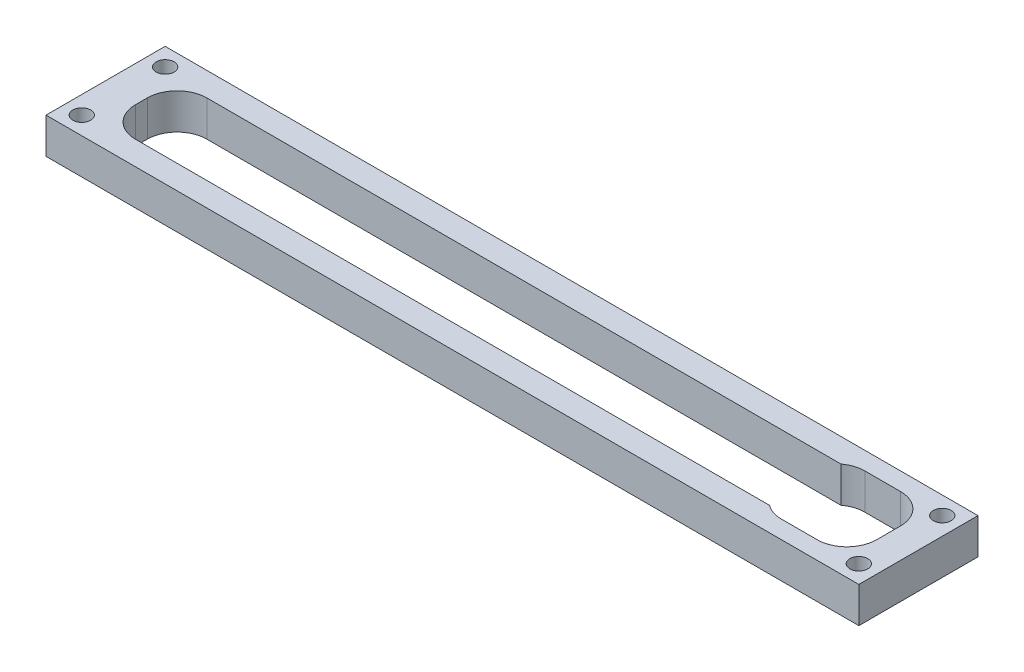
ISO-10303-21;
HEADER;
FILE_DESCRIPTION(('STEP AP214'),'2;1');
FILE_NAME('part.step','',(''),(''),'','','');
FILE_SCHEMA(('AUTOMOTIVE_DESIGN { 1 0 10303 214 1 1 1 1 }'));
ENDSEC;
DATA;
#1=APPLICATION_CONTEXT('core data for automotive mechanical design processes');
#2=APPLICATION_PROTOCOL_DEFINITION('international standard','automotive_design',2000,#1);
#3=PRODUCT_CONTEXT('',#1,'mechanical');
#4=PRODUCT('Part','Part','',(#3));
#5=PRODUCT_RELATED_PRODUCT_CATEGORY('part','',(#4));
#6=PRODUCT_DEFINITION_FORMATION('','',#4);
#7=PRODUCT_DEFINITION_CONTEXT('part definition',#1,'design');
#8=PRODUCT_DEFINITION('design','',#6,#7);
#9=PRODUCT_DEFINITION_SHAPE('','',#8);
#10=(LENGTH_UNIT() NAMED_UNIT(*) SI_UNIT(.MILLI.,.METRE.));
#11=(NAMED_UNIT(*) PLANE_ANGLE_UNIT() SI_UNIT($,.RADIAN.));
#12=(NAMED_UNIT(*) SI_UNIT($,.STERADIAN.) SOLID_ANGLE_UNIT());
#13=UNCERTAINTY_MEASURE_WITH_UNIT(LENGTH_MEASURE(1.E-05),#10,'distance_accuracy_value','');
#14=(GEOMETRIC_REPRESENTATION_CONTEXT(3) GLOBAL_UNCERTAINTY_ASSIGNED_CONTEXT((#13)) GLOBAL_UNIT_ASSIGNED_CONTEXT((#10,
#11,#12)) REPRESENTATION_CONTEXT('',''));
#15=CARTESIAN_POINT('',(0.,0.,0.));
#16=DIRECTION('',(0.,0.,1.));
#17=DIRECTION('',(1.,0.,0.));
#18=AXIS2_PLACEMENT_3D('',#15,#16,#17);
#19=CARTESIAN_POINT('',(0.,6.,0.));
#20=DIRECTION('',(0.,-1.,0.));
#21=DIRECTION('',(0.,0.,-1.));
#22=AXIS2_PLACEMENT_3D('',#19,#20,#21);
#23=PLANE('',#22);
#24=DIRECTION('',(0.,0.,1.));
#25=VECTOR('',#24,1.);
#26=CARTESIAN_POINT('',(0.,6.,0.));
#27=LINE('',#26,#25);
#28=CARTESIAN_POINT('',(0.,6.,-20.));
#29=VERTEX_POINT('',#28);
#30=CARTESIAN_POINT('',(0.,6.,0.));
#31=VERTEX_POINT('',#30);
#32=EDGE_CURVE('E250',#29,#31,#27,.T.);
#33=ORIENTED_EDGE('',*,*,#32,.T.);
#34=DIRECTION('',(1.,0.,0.));
#35=VECTOR('',#34,1.);
#36=CARTESIAN_POINT('',(0.,6.,0.));
#37=LINE('',#36,#35);
#38=CARTESIAN_POINT('',(136.427821804855,6.,0.));
#39=VERTEX_POINT('',#38);
#40=EDGE_CURVE('E253',#31,#39,#37,.T.);
#41=ORIENTED_EDGE('',*,*,#40,.T.);
#42=DIRECTION('',(0.,0.,-1.));
#43=VECTOR('',#42,1.);
#44=CARTESIAN_POINT('',(136.427821804855,6.,0.));
#45=LINE('',#44,#43);
#46=CARTESIAN_POINT('',(136.427821804855,6.,-20.));
#47=VERTEX_POINT('',#46);
#48=EDGE_CURVE('E256',#39,#47,#45,.T.);
#49=ORIENTED_EDGE('',*,*,#48,.T.);
#50=DIRECTION('',(-1.,0.,0.));
#51=VECTOR('',#50,1.);
#52=CARTESIAN_POINT('',(0.,6.,-20.));
#53=LINE('',#52,#51);
#54=EDGE_CURVE('E258',#47,#29,#53,.T.);
#55=ORIENTED_EDGE('',*,*,#54,.T.);
#56=EDGE_LOOP('',(#33,#41,#49,#55));
#57=FACE_BOUND('',#56,.T.);
#58=DIRECTION('',(-1.,0.,0.));
#59=VECTOR('',#58,1.);
#60=CARTESIAN_POINT('',(5.99999999999999,6.,-16.));
#61=LINE('',#60,#59);
#62=CARTESIAN_POINT('',(117.427821804855,6.,-16.));
#63=VERTEX_POINT('',#62);
#64=CARTESIAN_POINT('',(11.,6.,-16.));
#65=VERTEX_POINT('',#64);
#66=EDGE_CURVE('E243',#63,#65,#61,.T.);
#67=ORIENTED_EDGE('',*,*,#66,.F.);
#68=CARTESIAN_POINT('',(120.427821804855,6.,-12.));
#69=DIRECTION('',(0.,-1.,0.));
#70=DIRECTION('',(0.,0.,-1.));
#71=AXIS2_PLACEMENT_3D('',#68,#69,#70);
#72=CIRCLE('',#71,5.);
#73=CARTESIAN_POINT('',(120.427821804855,6.,-17.));
#74=VERTEX_POINT('',#73);
#75=EDGE_CURVE('E193',#63,#74,#72,.T.);
#76=ORIENTED_EDGE('',*,*,#75,.T.);
#77=DIRECTION('',(-1.,0.,0.));
#78=VECTOR('',#77,1.);
#79=CARTESIAN_POINT('',(117.427821804855,6.,-17.));
#80=LINE('',#79,#78);
#81=CARTESIAN_POINT('',(126.427821804855,6.,-17.));
#82=VERTEX_POINT('',#81);
#83=EDGE_CURVE('E205',#82,#74,#80,.T.);
#84=ORIENTED_EDGE('',*,*,#83,.F.);
#85=CARTESIAN_POINT('',(126.427821804855,6.,-12.));
#86=DIRECTION('',(0.,-1.,0.));
#87=DIRECTION('',(0.,0.,-1.));
#88=AXIS2_PLACEMENT_3D('',#85,#86,#87);
#89=CIRCLE('',#88,5.);
#90=CARTESIAN_POINT('',(131.427821804855,6.,-12.));
#91=VERTEX_POINT('',#90);
#92=EDGE_CURVE('E185',#82,#91,#89,.T.);
#93=ORIENTED_EDGE('',*,*,#92,.T.);
#94=DIRECTION('',(0.,0.,-1.));
#95=VECTOR('',#94,1.);
#96=CARTESIAN_POINT('',(131.427821804855,6.,-17.));
#97=LINE('',#96,#95);
#98=CARTESIAN_POINT('',(131.427821804855,6.,-8.00000000000001));
#99=VERTEX_POINT('',#98);
#100=EDGE_CURVE('E202',#99,#91,#97,.T.);
#101=ORIENTED_EDGE('',*,*,#100,.F.);
#102=CARTESIAN_POINT('',(126.427821804855,6.,-8.00000000000001));
#103=DIRECTION('',(0.,-1.,0.));
#104=DIRECTION('',(0.,0.,-1.));
#105=AXIS2_PLACEMENT_3D('',#102,#103,#104);
#106=CIRCLE('',#105,5.);
#107=CARTESIAN_POINT('',(126.427821804855,6.,-3.00000000000001));
#108=VERTEX_POINT('',#107);
#109=EDGE_CURVE('E189',#99,#108,#106,.T.);
#110=ORIENTED_EDGE('',*,*,#109,.T.);
#111=DIRECTION('',(1.,0.,0.));
#112=VECTOR('',#111,1.);
#113=CARTESIAN_POINT('',(117.427821804855,6.,-3.00000000000001));
#114=LINE('',#113,#112);
#115=CARTESIAN_POINT('',(120.427821804855,6.,-3.00000000000001));
#116=VERTEX_POINT('',#115);
#117=EDGE_CURVE('E200',#116,#108,#114,.T.);
#118=ORIENTED_EDGE('',*,*,#117,.F.);
#119=CARTESIAN_POINT('',(120.427821804855,6.,-8.00000000000001));
#120=DIRECTION('',(0.,-1.,0.));
#121=DIRECTION('',(0.,0.,-1.));
#122=AXIS2_PLACEMENT_3D('',#119,#120,#121);
#123=CIRCLE('',#122,5.);
#124=CARTESIAN_POINT('',(117.427821804855,6.,-4.00000000000002));
#125=VERTEX_POINT('',#124);
#126=EDGE_CURVE('E43',#116,#125,#123,.T.);
#127=ORIENTED_EDGE('',*,*,#126,.T.);
#128=DIRECTION('',(1.,0.,0.));
#129=VECTOR('',#128,1.);
#130=CARTESIAN_POINT('',(5.99999999999999,6.,-4.00000000000002));
#131=LINE('',#130,#129);
#132=CARTESIAN_POINT('',(11.,6.,-4.00000000000002));
#133=VERTEX_POINT('',#132);
#134=EDGE_CURVE('E162',#133,#125,#131,.T.);
#135=ORIENTED_EDGE('',*,*,#134,.F.);
#136=CARTESIAN_POINT('',(11.,6.,-9.00000000000001));
#137=DIRECTION('',(0.,-1.,0.));
#138=DIRECTION('',(0.,0.,-1.));
#139=AXIS2_PLACEMENT_3D('',#136,#137,#138);
#140=CIRCLE('',#139,5.);
#141=CARTESIAN_POINT('',(5.99999999999999,6.,-9.00000000000001));
#142=VERTEX_POINT('',#141);
#143=EDGE_CURVE('E179',#133,#142,#140,.T.);
#144=ORIENTED_EDGE('',*,*,#143,.T.);
#145=DIRECTION('',(0.,0.,1.));
#146=VECTOR('',#145,1.);
#147=CARTESIAN_POINT('',(5.99999999999999,6.,-16.));
#148=LINE('',#147,#146);
#149=CARTESIAN_POINT('',(5.99999999999999,6.,-11.));
#150=VERTEX_POINT('',#149);
#151=EDGE_CURVE('E239',#150,#142,#148,.T.);
#152=ORIENTED_EDGE('',*,*,#151,.F.);
#153=CARTESIAN_POINT('',(11.,6.,-11.));
#154=DIRECTION('',(0.,-1.,0.));
#155=DIRECTION('',(0.,0.,-1.));
#156=AXIS2_PLACEMENT_3D('',#153,#154,#155);
#157=CIRCLE('',#156,5.);
#158=EDGE_CURVE('E183',#150,#65,#157,.T.);
#159=ORIENTED_EDGE('',*,*,#158,.T.);
#160=EDGE_LOOP('',(#67,#76,#84,#93,#101,#110,#118,#127,#135,#144,#152,#159));
#161=FACE_BOUND('',#160,.T.);
#162=CARTESIAN_POINT('',(3.,6.,-17.));
#163=DIRECTION('',(0.,1.,0.));
#164=DIRECTION('',(0.,0.,1.));
#165=AXIS2_PLACEMENT_3D('',#162,#163,#164);
#166=CIRCLE('',#165,1.5);
#167=CARTESIAN_POINT('',(3.,6.,-15.5));
#168=VERTEX_POINT('',#167);
#169=EDGE_CURVE('E234',#168,#168,#166,.T.);
#170=ORIENTED_EDGE('',*,*,#169,.F.);
#171=EDGE_LOOP('',(#170));
#172=FACE_BOUND('',#171,.T.);
#173=CARTESIAN_POINT('',(3.,6.,-3.));
#174=DIRECTION('',(0.,1.,0.));
#175=DIRECTION('',(0.,0.,-1.));
#176=AXIS2_PLACEMENT_3D('',#173,#174,#175);
#177=CIRCLE('',#176,1.5);
#178=CARTESIAN_POINT('',(3.,6.,-4.5));
#179=VERTEX_POINT('',#178);
#180=EDGE_CURVE('E228',#179,#179,#177,.T.);
#181=ORIENTED_EDGE('',*,*,#180,.F.);
#182=EDGE_LOOP('',(#181));
#183=FACE_BOUND('',#182,.T.);
#184=CARTESIAN_POINT('',(133.427821804855,6.,-3.00000000000002));
#185=DIRECTION('',(0.,1.,0.));
#186=DIRECTION('',(0.,0.,1.));
#187=AXIS2_PLACEMENT_3D('',#184,#185,#186);
#188=CIRCLE('',#187,1.5);
#189=CARTESIAN_POINT('',(133.427821804855,6.,-1.50000000000002));
#190=VERTEX_POINT('',#189);
#191=EDGE_CURVE('E222',#190,#190,#188,.T.);
#192=ORIENTED_EDGE('',*,*,#191,.F.);
#193=EDGE_LOOP('',(#192));
#194=FACE_BOUND('',#193,.T.);
#195=CARTESIAN_POINT('',(133.427821804855,6.,-17.0000000000001));
#196=DIRECTION('',(0.,1.,0.));
#197=DIRECTION('',(0.,0.,-1.));
#198=AXIS2_PLACEMENT_3D('',#195,#196,#197);
#199=CIRCLE('',#198,1.5);
#200=CARTESIAN_POINT('',(133.427821804855,6.,-18.5));
#201=VERTEX_POINT('',#200);
#202=EDGE_CURVE('E216',#201,#201,#199,.T.);
#203=ORIENTED_EDGE('',*,*,#202,.F.);
#204=EDGE_LOOP('',(#203));
#205=FACE_BOUND('',#204,.T.);
#206=ADVANCED_FACE('F35',(#57,#161,#172,#183,#194,#205),#23,.F.);
#207=CARTESIAN_POINT('',(0.,0.,0.));
#208=DIRECTION('',(0.,-1.,0.));
#209=DIRECTION('',(0.,0.,-1.));
#210=AXIS2_PLACEMENT_3D('',#207,#208,#209);
#211=PLANE('',#210);
#212=DIRECTION('',(-1.,0.,0.));
#213=VECTOR('',#212,1.);
#214=CARTESIAN_POINT('',(117.427821804855,0.,-17.));
#215=LINE('',#214,#213);
#216=CARTESIAN_POINT('',(126.427821804855,0.,-17.));
#217=VERTEX_POINT('',#216);
#218=CARTESIAN_POINT('',(120.427821804855,0.,-17.));
#219=VERTEX_POINT('',#218);
#220=EDGE_CURVE('E165',#217,#219,#215,.T.);
#221=ORIENTED_EDGE('',*,*,#220,.T.);
#222=CARTESIAN_POINT('',(120.427821804855,0.,-12.));
#223=DIRECTION('',(0.,-1.,0.));
#224=DIRECTION('',(0.,0.,-1.));
#225=AXIS2_PLACEMENT_3D('',#222,#223,#224);
#226=CIRCLE('',#225,5.);
#227=CARTESIAN_POINT('',(117.427821804855,0.,-16.));
#228=VERTEX_POINT('',#227);
#229=EDGE_CURVE('E195',#219,#228,#226,.F.);
#230=ORIENTED_EDGE('',*,*,#229,.T.);
#231=DIRECTION('',(-1.,0.,0.));
#232=VECTOR('',#231,1.);
#233=CARTESIAN_POINT('',(5.99999999999999,0.,-16.));
#234=LINE('',#233,#232);
#235=CARTESIAN_POINT('',(11.,0.,-16.));
#236=VERTEX_POINT('',#235);
#237=EDGE_CURVE('E154',#228,#236,#234,.T.);
#238=ORIENTED_EDGE('',*,*,#237,.T.);
#239=CARTESIAN_POINT('',(11.,0.,-11.));
#240=DIRECTION('',(0.,-1.,0.));
#241=DIRECTION('',(0.,0.,-1.));
#242=AXIS2_PLACEMENT_3D('',#239,#240,#241);
#243=CIRCLE('',#242,5.);
#244=CARTESIAN_POINT('',(5.99999999999999,0.,-11.));
#245=VERTEX_POINT('',#244);
#246=EDGE_CURVE('E181',#236,#245,#243,.F.);
#247=ORIENTED_EDGE('',*,*,#246,.T.);
#248=DIRECTION('',(0.,0.,1.));
#249=VECTOR('',#248,1.);
#250=CARTESIAN_POINT('',(5.99999999999999,0.,-16.));
#251=LINE('',#250,#249);
#252=CARTESIAN_POINT('',(5.99999999999999,0.,-9.00000000000001));
#253=VERTEX_POINT('',#252);
#254=EDGE_CURVE('E155',#245,#253,#251,.T.);
#255=ORIENTED_EDGE('',*,*,#254,.T.);
#256=CARTESIAN_POINT('',(11.,0.,-9.00000000000001));
#257=DIRECTION('',(0.,-1.,0.));
#258=DIRECTION('',(0.,0.,-1.));
#259=AXIS2_PLACEMENT_3D('',#256,#257,#258);
#260=CIRCLE('',#259,5.);
#261=CARTESIAN_POINT('',(11.,0.,-4.00000000000002));
#262=VERTEX_POINT('',#261);
#263=EDGE_CURVE('E151',#253,#262,#260,.F.);
#264=ORIENTED_EDGE('',*,*,#263,.T.);
#265=DIRECTION('',(1.,0.,0.));
#266=VECTOR('',#265,1.);
#267=CARTESIAN_POINT('',(5.99999999999999,0.,-4.00000000000002));
#268=LINE('',#267,#266);
#269=CARTESIAN_POINT('',(117.427821804855,0.,-4.00000000000002));
#270=VERTEX_POINT('',#269);
#271=EDGE_CURVE('E145',#262,#270,#268,.T.);
#272=ORIENTED_EDGE('',*,*,#271,.T.);
#273=CARTESIAN_POINT('',(120.427821804855,0.,-8.00000000000001));
#274=DIRECTION('',(0.,-1.,0.));
#275=DIRECTION('',(0.,0.,-1.));
#276=AXIS2_PLACEMENT_3D('',#273,#274,#275);
#277=CIRCLE('',#276,5.);
#278=CARTESIAN_POINT('',(120.427821804855,0.,-3.00000000000001));
#279=VERTEX_POINT('',#278);
#280=EDGE_CURVE('E11',#270,#279,#277,.F.);
#281=ORIENTED_EDGE('',*,*,#280,.T.);
#282=DIRECTION('',(1.,0.,0.));
#283=VECTOR('',#282,1.);
#284=CARTESIAN_POINT('',(117.427821804855,0.,-3.00000000000001));
#285=LINE('',#284,#283);
#286=CARTESIAN_POINT('',(126.427821804855,0.,-3.00000000000001));
#287=VERTEX_POINT('',#286);
#288=EDGE_CURVE('E212',#279,#287,#285,.T.);
#289=ORIENTED_EDGE('',*,*,#288,.T.);
#290=CARTESIAN_POINT('',(126.427821804855,0.,-8.00000000000001));
#291=DIRECTION('',(0.,-1.,0.));
#292=DIRECTION('',(0.,0.,-1.));
#293=AXIS2_PLACEMENT_3D('',#290,#291,#292);
#294=CIRCLE('',#293,5.);
#295=CARTESIAN_POINT('',(131.427821804855,0.,-8.00000000000001));
#296=VERTEX_POINT('',#295);
#297=EDGE_CURVE('E191',#287,#296,#294,.F.);
#298=ORIENTED_EDGE('',*,*,#297,.T.);
#299=DIRECTION('',(0.,0.,-1.));
#300=VECTOR('',#299,1.);
#301=CARTESIAN_POINT('',(131.427821804855,0.,-17.));
#302=LINE('',#301,#300);
#303=CARTESIAN_POINT('',(131.427821804855,0.,-12.));
#304=VERTEX_POINT('',#303);
#305=EDGE_CURVE('E300',#296,#304,#302,.T.);
#306=ORIENTED_EDGE('',*,*,#305,.T.);
#307=CARTESIAN_POINT('',(126.427821804855,0.,-12.));
#308=DIRECTION('',(0.,-1.,0.));
#309=DIRECTION('',(0.,0.,-1.));
#310=AXIS2_PLACEMENT_3D('',#307,#308,#309);
#311=CIRCLE('',#310,5.);
#312=EDGE_CURVE('E187',#304,#217,#311,.F.);
#313=ORIENTED_EDGE('',*,*,#312,.T.);
#314=EDGE_LOOP('',(#221,#230,#238,#247,#255,#264,#272,#281,#289,#298,#306,#313));
#315=FACE_BOUND('',#314,.T.);
#316=CARTESIAN_POINT('',(133.427821804855,0.,-3.00000000000002));
#317=DIRECTION('',(0.,1.,0.));
#318=DIRECTION('',(0.,0.,1.));
#319=AXIS2_PLACEMENT_3D('',#316,#317,#318);
#320=CIRCLE('',#319,1.5);
#321=CARTESIAN_POINT('',(133.427821804855,0.,-1.50000000000002));
#322=VERTEX_POINT('',#321);
#323=EDGE_CURVE('E219',#322,#322,#320,.T.);
#324=ORIENTED_EDGE('',*,*,#323,.T.);
#325=EDGE_LOOP('',(#324));
#326=FACE_BOUND('',#325,.T.);
#327=CARTESIAN_POINT('',(3.,0.,-17.));
#328=DIRECTION('',(0.,1.,0.));
#329=DIRECTION('',(0.,0.,1.));
#330=AXIS2_PLACEMENT_3D('',#327,#328,#329);
#331=CIRCLE('',#330,1.5);
#332=CARTESIAN_POINT('',(3.,0.,-15.5));
#333=VERTEX_POINT('',#332);
#334=EDGE_CURVE('E231',#333,#333,#331,.T.);
#335=ORIENTED_EDGE('',*,*,#334,.T.);
#336=EDGE_LOOP('',(#335));
#337=FACE_BOUND('',#336,.T.);
#338=DIRECTION('',(0.,0.,1.));
#339=VECTOR('',#338,1.);
#340=CARTESIAN_POINT('',(0.,0.,0.));
#341=LINE('',#340,#339);
#342=CARTESIAN_POINT('',(0.,0.,-20.));
#343=VERTEX_POINT('',#342);
#344=CARTESIAN_POINT('',(0.,0.,0.));
#345=VERTEX_POINT('',#344);
#346=EDGE_CURVE('E246',#343,#345,#341,.T.);
#347=ORIENTED_EDGE('',*,*,#346,.F.);
#348=DIRECTION('',(-1.,0.,0.));
#349=VECTOR('',#348,1.);
#350=CARTESIAN_POINT('',(0.,0.,-20.));
#351=LINE('',#350,#349);
#352=CARTESIAN_POINT('',(136.427821804855,0.,-20.));
#353=VERTEX_POINT('',#352);
#354=EDGE_CURVE('E254',#353,#343,#351,.T.);
#355=ORIENTED_EDGE('',*,*,#354,.F.);
#356=DIRECTION('',(0.,0.,-1.));
#357=VECTOR('',#356,1.);
#358=CARTESIAN_POINT('',(136.427821804855,0.,0.));
#359=LINE('',#358,#357);
#360=CARTESIAN_POINT('',(136.427821804855,0.,0.));
#361=VERTEX_POINT('',#360);
#362=EDGE_CURVE('E265',#361,#353,#359,.T.);
#363=ORIENTED_EDGE('',*,*,#362,.F.);
#364=DIRECTION('',(1.,0.,0.));
#365=VECTOR('',#364,1.);
#366=CARTESIAN_POINT('',(0.,0.,0.));
#367=LINE('',#366,#365);
#368=EDGE_CURVE('E263',#345,#361,#367,.T.);
#369=ORIENTED_EDGE('',*,*,#368,.F.);
#370=EDGE_LOOP('',(#347,#355,#363,#369));
#371=FACE_BOUND('',#370,.T.);
#372=CARTESIAN_POINT('',(3.,0.,-3.));
#373=DIRECTION('',(0.,1.,0.));
#374=DIRECTION('',(0.,0.,-1.));
#375=AXIS2_PLACEMENT_3D('',#372,#373,#374);
#376=CIRCLE('',#375,1.5);
#377=CARTESIAN_POINT('',(3.,0.,-4.5));
#378=VERTEX_POINT('',#377);
#379=EDGE_CURVE('E225',#378,#378,#376,.T.);
#380=ORIENTED_EDGE('',*,*,#379,.T.);
#381=EDGE_LOOP('',(#380));
#382=FACE_BOUND('',#381,.T.);
#383=CARTESIAN_POINT('',(133.427821804855,0.,-17.0000000000001));
#384=DIRECTION('',(0.,1.,0.));
#385=DIRECTION('',(0.,0.,-1.));
#386=AXIS2_PLACEMENT_3D('',#383,#384,#385);
#387=CIRCLE('',#386,1.5);
#388=CARTESIAN_POINT('',(133.427821804855,0.,-18.5));
#389=VERTEX_POINT('',#388);
#390=EDGE_CURVE('E214',#389,#389,#387,.T.);
#391=ORIENTED_EDGE('',*,*,#390,.T.);
#392=EDGE_LOOP('',(#391));
#393=FACE_BOUND('',#392,.T.);
#394=ADVANCED_FACE('F148',(#315,#326,#337,#371,#382,#393),#211,.T.);
#395=CARTESIAN_POINT('',(0.,6.,0.));
#396=DIRECTION('',(1.,0.,0.));
#397=DIRECTION('',(0.,0.,-1.));
#398=AXIS2_PLACEMENT_3D('',#395,#396,#397);
#399=PLANE('',#398);
#400=ORIENTED_EDGE('',*,*,#346,.T.);
#401=DIRECTION('',(0.,-1.,0.));
#402=VECTOR('',#401,1.);
#403=CARTESIAN_POINT('',(0.,6.,0.));
#404=LINE('',#403,#402);
#405=EDGE_CURVE('E276',#31,#345,#404,.T.);
#406=ORIENTED_EDGE('',*,*,#405,.F.);
#407=ORIENTED_EDGE('',*,*,#32,.F.);
#408=DIRECTION('',(0.,-1.,0.));
#409=VECTOR('',#408,1.);
#410=CARTESIAN_POINT('',(0.,6.,-20.));
#411=LINE('',#410,#409);
#412=EDGE_CURVE('E260',#29,#343,#411,.T.);
#413=ORIENTED_EDGE('',*,*,#412,.T.);
#414=EDGE_LOOP('',(#400,#406,#407,#413));
#415=FACE_BOUND('',#414,.T.);
#416=ADVANCED_FACE('F331',(#415),#399,.F.);
#417=CARTESIAN_POINT('',(0.,6.,0.));
#418=DIRECTION('',(0.,0.,-1.));
#419=DIRECTION('',(-1.,0.,0.));
#420=AXIS2_PLACEMENT_3D('',#417,#418,#419);
#421=PLANE('',#420);
#422=ORIENTED_EDGE('',*,*,#368,.T.);
#423=DIRECTION('',(0.,-1.,0.));
#424=VECTOR('',#423,1.);
#425=CARTESIAN_POINT('',(136.427821804855,6.,0.));
#426=LINE('',#425,#424);
#427=EDGE_CURVE('E273',#39,#361,#426,.T.);
#428=ORIENTED_EDGE('',*,*,#427,.F.);
#429=ORIENTED_EDGE('',*,*,#40,.F.);
#430=ORIENTED_EDGE('',*,*,#405,.T.);
#431=EDGE_LOOP('',(#422,#428,#429,#430));
#432=FACE_BOUND('',#431,.T.);
#433=ADVANCED_FACE('F344',(#432),#421,.F.);
#434=CARTESIAN_POINT('',(136.427821804855,6.,0.));
#435=DIRECTION('',(-1.,0.,0.));
#436=DIRECTION('',(0.,0.,1.));
#437=AXIS2_PLACEMENT_3D('',#434,#435,#436);
#438=PLANE('',#437);
#439=ORIENTED_EDGE('',*,*,#362,.T.);
#440=DIRECTION('',(0.,-1.,0.));
#441=VECTOR('',#440,1.);
#442=CARTESIAN_POINT('',(136.427821804855,6.,-20.));
#443=LINE('',#442,#441);
#444=EDGE_CURVE('E270',#47,#353,#443,.T.);
#445=ORIENTED_EDGE('',*,*,#444,.F.);
#446=ORIENTED_EDGE('',*,*,#48,.F.);
#447=ORIENTED_EDGE('',*,*,#427,.T.);
#448=EDGE_LOOP('',(#439,#445,#446,#447));
#449=FACE_BOUND('',#448,.T.);
#450=ADVANCED_FACE('F340',(#449),#438,.F.);
#451=CARTESIAN_POINT('',(0.,6.,-20.));
#452=DIRECTION('',(0.,0.,1.));
#453=DIRECTION('',(1.,0.,0.));
#454=AXIS2_PLACEMENT_3D('',#451,#452,#453);
#455=PLANE('',#454);
#456=ORIENTED_EDGE('',*,*,#354,.T.);
#457=ORIENTED_EDGE('',*,*,#412,.F.);
#458=ORIENTED_EDGE('',*,*,#54,.F.);
#459=ORIENTED_EDGE('',*,*,#444,.T.);
#460=EDGE_LOOP('',(#456,#457,#458,#459));
#461=FACE_BOUND('',#460,.T.);
#462=ADVANCED_FACE('F337',(#461),#455,.F.);
#463=CARTESIAN_POINT('',(5.99999999999999,6.,-16.));
#464=DIRECTION('',(1.,0.,0.));
#465=DIRECTION('',(0.,0.,-1.));
#466=AXIS2_PLACEMENT_3D('',#463,#464,#465);
#467=PLANE('',#466);
#468=ORIENTED_EDGE('',*,*,#151,.T.);
#469=DIRECTION('',(0.,-1.,0.));
#470=VECTOR('',#469,1.);
#471=CARTESIAN_POINT('',(5.99999999999999,0.,-9.00000000000001));
#472=LINE('',#471,#470);
#473=EDGE_CURVE('E281',#142,#253,#472,.T.);
#474=ORIENTED_EDGE('',*,*,#473,.T.);
#475=ORIENTED_EDGE('',*,*,#254,.F.);
#476=DIRECTION('',(0.,-1.,0.));
#477=VECTOR('',#476,1.);
#478=CARTESIAN_POINT('',(5.99999999999999,6.,-11.));
#479=LINE('',#478,#477);
#480=EDGE_CURVE('E279',#245,#150,#479,.F.);
#481=ORIENTED_EDGE('',*,*,#480,.T.);
#482=EDGE_LOOP('',(#468,#474,#475,#481));
#483=FACE_BOUND('',#482,.T.);
#484=ADVANCED_FACE('F334',(#483),#467,.T.);
#485=CARTESIAN_POINT('',(5.99999999999999,6.,-4.00000000000002));
#486=DIRECTION('',(0.,0.,-1.));
#487=DIRECTION('',(-1.,0.,0.));
#488=AXIS2_PLACEMENT_3D('',#485,#486,#487);
#489=PLANE('',#488);
#490=ORIENTED_EDGE('',*,*,#271,.F.);
#491=DIRECTION('',(0.,-1.,0.));
#492=VECTOR('',#491,1.);
#493=CARTESIAN_POINT('',(11.,6.,-4.00000000000002));
#494=LINE('',#493,#492);
#495=EDGE_CURVE('E284',#262,#133,#494,.F.);
#496=ORIENTED_EDGE('',*,*,#495,.T.);
#497=ORIENTED_EDGE('',*,*,#134,.T.);
#498=DIRECTION('',(0.,1.,0.));
#499=VECTOR('',#498,1.);
#500=CARTESIAN_POINT('',(117.427821804855,0.,-4.00000000000002));
#501=LINE('',#500,#499);
#502=EDGE_CURVE('E159',#270,#125,#501,.T.);
#503=ORIENTED_EDGE('',*,*,#502,.F.);
#504=EDGE_LOOP('',(#490,#496,#497,#503));
#505=FACE_BOUND('',#504,.T.);
#506=ADVANCED_FACE('F160',(#505),#489,.T.);
#507=CARTESIAN_POINT('',(5.99999999999999,6.,-16.));
#508=DIRECTION('',(0.,0.,1.));
#509=DIRECTION('',(1.,0.,0.));
#510=AXIS2_PLACEMENT_3D('',#507,#508,#509);
#511=PLANE('',#510);
#512=ORIENTED_EDGE('',*,*,#66,.T.);
#513=DIRECTION('',(0.,-1.,0.));
#514=VECTOR('',#513,1.);
#515=CARTESIAN_POINT('',(11.,0.,-16.));
#516=LINE('',#515,#514);
#517=EDGE_CURVE('E286',#65,#236,#516,.T.);
#518=ORIENTED_EDGE('',*,*,#517,.T.);
#519=ORIENTED_EDGE('',*,*,#237,.F.);
#520=DIRECTION('',(0.,1.,0.));
#521=VECTOR('',#520,1.);
#522=CARTESIAN_POINT('',(117.427821804855,0.,-16.));
#523=LINE('',#522,#521);
#524=EDGE_CURVE('E164',#228,#63,#523,.T.);
#525=ORIENTED_EDGE('',*,*,#524,.T.);
#526=EDGE_LOOP('',(#512,#518,#519,#525));
#527=FACE_BOUND('',#526,.T.);
#528=ADVANCED_FACE('F366',(#527),#511,.T.);
#529=CARTESIAN_POINT('',(3.,6.,-17.));
#530=DIRECTION('',(0.,-1.,0.));
#531=DIRECTION('',(0.,0.,-1.));
#532=AXIS2_PLACEMENT_3D('',#529,#530,#531);
#533=CYLINDRICAL_SURFACE('',#532,1.5);
#534=ORIENTED_EDGE('',*,*,#169,.T.);
#535=EDGE_LOOP('',(#534));
#536=FACE_BOUND('',#535,.T.);
#537=ORIENTED_EDGE('',*,*,#334,.F.);
#538=EDGE_LOOP('',(#537));
#539=FACE_BOUND('',#538,.T.);
#540=ADVANCED_FACE('F379',(#536,#539),#533,.F.);
#541=CARTESIAN_POINT('',(3.,6.,-3.));
#542=DIRECTION('',(0.,-1.,0.));
#543=DIRECTION('',(0.,0.,-1.));
#544=AXIS2_PLACEMENT_3D('',#541,#542,#543);
#545=CYLINDRICAL_SURFACE('',#544,1.5);
#546=ORIENTED_EDGE('',*,*,#180,.T.);
#547=EDGE_LOOP('',(#546));
#548=FACE_BOUND('',#547,.T.);
#549=ORIENTED_EDGE('',*,*,#379,.F.);
#550=EDGE_LOOP('',(#549));
#551=FACE_BOUND('',#550,.T.);
#552=ADVANCED_FACE('F384',(#548,#551),#545,.F.);
#553=CARTESIAN_POINT('',(133.427821804855,6.,-3.00000000000002));
#554=DIRECTION('',(0.,-1.,0.));
#555=DIRECTION('',(0.,0.,-1.));
#556=AXIS2_PLACEMENT_3D('',#553,#554,#555);
#557=CYLINDRICAL_SURFACE('',#556,1.5);
#558=ORIENTED_EDGE('',*,*,#191,.T.);
#559=EDGE_LOOP('',(#558));
#560=FACE_BOUND('',#559,.T.);
#561=ORIENTED_EDGE('',*,*,#323,.F.);
#562=EDGE_LOOP('',(#561));
#563=FACE_BOUND('',#562,.T.);
#564=ADVANCED_FACE('F388',(#560,#563),#557,.F.);
#565=CARTESIAN_POINT('',(133.427821804855,6.,-17.0000000000001));
#566=DIRECTION('',(0.,-1.,0.));
#567=DIRECTION('',(0.,0.,-1.));
#568=AXIS2_PLACEMENT_3D('',#565,#566,#567);
#569=CYLINDRICAL_SURFACE('',#568,1.5);
#570=ORIENTED_EDGE('',*,*,#202,.T.);
#571=EDGE_LOOP('',(#570));
#572=FACE_BOUND('',#571,.T.);
#573=ORIENTED_EDGE('',*,*,#390,.F.);
#574=EDGE_LOOP('',(#573));
#575=FACE_BOUND('',#574,.T.);
#576=ADVANCED_FACE('F392',(#572,#575),#569,.F.);
#577=CARTESIAN_POINT('',(117.427821804855,0.,-17.));
#578=DIRECTION('',(0.,0.,-1.));
#579=DIRECTION('',(-1.,0.,0.));
#580=AXIS2_PLACEMENT_3D('',#577,#578,#579);
#581=PLANE('',#580);
#582=ORIENTED_EDGE('',*,*,#220,.F.);
#583=DIRECTION('',(0.,1.,0.));
#584=VECTOR('',#583,1.);
#585=CARTESIAN_POINT('',(126.427821804855,6.,-17.));
#586=LINE('',#585,#584);
#587=EDGE_CURVE('E291',#217,#82,#586,.T.);
#588=ORIENTED_EDGE('',*,*,#587,.T.);
#589=ORIENTED_EDGE('',*,*,#83,.T.);
#590=DIRECTION('',(0.,1.,0.));
#591=VECTOR('',#590,1.);
#592=CARTESIAN_POINT('',(120.427821804855,0.,-17.));
#593=LINE('',#592,#591);
#594=EDGE_CURVE('E289',#74,#219,#593,.F.);
#595=ORIENTED_EDGE('',*,*,#594,.T.);
#596=EDGE_LOOP('',(#582,#588,#589,#595));
#597=FACE_BOUND('',#596,.T.);
#598=ADVANCED_FACE('F310',(#597),#581,.F.);
#599=CARTESIAN_POINT('',(131.427821804855,0.,-17.));
#600=DIRECTION('',(1.,0.,0.));
#601=DIRECTION('',(0.,0.,-1.));
#602=AXIS2_PLACEMENT_3D('',#599,#600,#601);
#603=PLANE('',#602);
#604=ORIENTED_EDGE('',*,*,#100,.T.);
#605=DIRECTION('',(0.,1.,0.));
#606=VECTOR('',#605,1.);
#607=CARTESIAN_POINT('',(131.427821804855,0.,-12.));
#608=LINE('',#607,#606);
#609=EDGE_CURVE('E171',#91,#304,#608,.F.);
#610=ORIENTED_EDGE('',*,*,#609,.T.);
#611=ORIENTED_EDGE('',*,*,#305,.F.);
#612=DIRECTION('',(0.,1.,0.));
#613=VECTOR('',#612,1.);
#614=CARTESIAN_POINT('',(131.427821804855,6.,-8.00000000000001));
#615=LINE('',#614,#613);
#616=EDGE_CURVE('E174',#296,#99,#615,.T.);
#617=ORIENTED_EDGE('',*,*,#616,.T.);
#618=EDGE_LOOP('',(#604,#610,#611,#617));
#619=FACE_BOUND('',#618,.T.);
#620=ADVANCED_FACE('F297',(#619),#603,.F.);
#621=CARTESIAN_POINT('',(117.427821804855,0.,-3.00000000000001));
#622=DIRECTION('',(0.,0.,1.));
#623=DIRECTION('',(1.,0.,0.));
#624=AXIS2_PLACEMENT_3D('',#621,#622,#623);
#625=PLANE('',#624);
#626=ORIENTED_EDGE('',*,*,#117,.T.);
#627=DIRECTION('',(0.,1.,0.));
#628=VECTOR('',#627,1.);
#629=CARTESIAN_POINT('',(126.427821804855,0.,-3.00000000000001));
#630=LINE('',#629,#628);
#631=EDGE_CURVE('E50',#108,#287,#630,.F.);
#632=ORIENTED_EDGE('',*,*,#631,.T.);
#633=ORIENTED_EDGE('',*,*,#288,.F.);
#634=DIRECTION('',(0.,-1.,0.));
#635=VECTOR('',#634,1.);
#636=CARTESIAN_POINT('',(120.427821804855,0.,-3.00000000000001));
#637=LINE('',#636,#635);
#638=EDGE_CURVE('E169',#279,#116,#637,.F.);
#639=ORIENTED_EDGE('',*,*,#638,.T.);
#640=EDGE_LOOP('',(#626,#632,#633,#639));
#641=FACE_BOUND('',#640,.T.);
#642=ADVANCED_FACE('F355',(#641),#625,.F.);
#643=CARTESIAN_POINT('',(11.,6.,-9.00000000000001));
#644=DIRECTION('',(0.,1.,0.));
#645=DIRECTION('',(0.,0.,1.));
#646=AXIS2_PLACEMENT_3D('',#643,#644,#645);
#647=CYLINDRICAL_SURFACE('',#646,5.);
#648=ORIENTED_EDGE('',*,*,#143,.F.);
#649=ORIENTED_EDGE('',*,*,#495,.F.);
#650=ORIENTED_EDGE('',*,*,#263,.F.);
#651=ORIENTED_EDGE('',*,*,#473,.F.);
#652=EDGE_LOOP('',(#648,#649,#650,#651));
#653=FACE_BOUND('',#652,.T.);
#654=ADVANCED_FACE('F352',(#653),#647,.F.);
#655=CARTESIAN_POINT('',(11.,6.,-11.));
#656=DIRECTION('',(0.,1.,0.));
#657=DIRECTION('',(0.,0.,1.));
#658=AXIS2_PLACEMENT_3D('',#655,#656,#657);
#659=CYLINDRICAL_SURFACE('',#658,5.);
#660=ORIENTED_EDGE('',*,*,#158,.F.);
#661=ORIENTED_EDGE('',*,*,#480,.F.);
#662=ORIENTED_EDGE('',*,*,#246,.F.);
#663=ORIENTED_EDGE('',*,*,#517,.F.);
#664=EDGE_LOOP('',(#660,#661,#662,#663));
#665=FACE_BOUND('',#664,.T.);
#666=ADVANCED_FACE('F323',(#665),#659,.F.);
#667=CARTESIAN_POINT('',(126.427821804855,0.,-12.));
#668=DIRECTION('',(0.,-1.,0.));
#669=DIRECTION('',(0.,0.,-1.));
#670=AXIS2_PLACEMENT_3D('',#667,#668,#669);
#671=CYLINDRICAL_SURFACE('',#670,5.);
#672=ORIENTED_EDGE('',*,*,#312,.F.);
#673=ORIENTED_EDGE('',*,*,#609,.F.);
#674=ORIENTED_EDGE('',*,*,#92,.F.);
#675=ORIENTED_EDGE('',*,*,#587,.F.);
#676=EDGE_LOOP('',(#672,#673,#674,#675));
#677=FACE_BOUND('',#676,.T.);
#678=ADVANCED_FACE('F307',(#677),#671,.F.);
#679=CARTESIAN_POINT('',(126.427821804855,0.,-8.00000000000001));
#680=DIRECTION('',(0.,-1.,0.));
#681=DIRECTION('',(0.,0.,-1.));
#682=AXIS2_PLACEMENT_3D('',#679,#680,#681);
#683=CYLINDRICAL_SURFACE('',#682,5.);
#684=ORIENTED_EDGE('',*,*,#297,.F.);
#685=ORIENTED_EDGE('',*,*,#631,.F.);
#686=ORIENTED_EDGE('',*,*,#109,.F.);
#687=ORIENTED_EDGE('',*,*,#616,.F.);
#688=EDGE_LOOP('',(#684,#685,#686,#687));
#689=FACE_BOUND('',#688,.T.);
#690=ADVANCED_FACE('F314',(#689),#683,.F.);
#691=CARTESIAN_POINT('',(120.427821804855,0.,-12.));
#692=DIRECTION('',(0.,1.,0.));
#693=DIRECTION('',(0.,0.,1.));
#694=AXIS2_PLACEMENT_3D('',#691,#692,#693);
#695=CYLINDRICAL_SURFACE('',#694,5.);
#696=ORIENTED_EDGE('',*,*,#229,.F.);
#697=ORIENTED_EDGE('',*,*,#594,.F.);
#698=ORIENTED_EDGE('',*,*,#75,.F.);
#699=ORIENTED_EDGE('',*,*,#524,.F.);
#700=EDGE_LOOP('',(#696,#697,#698,#699));
#701=FACE_BOUND('',#700,.T.);
#702=ADVANCED_FACE('F316',(#701),#695,.F.);
#703=CARTESIAN_POINT('',(120.427821804855,0.,-8.00000000000001));
#704=DIRECTION('',(0.,-1.,0.));
#705=DIRECTION('',(0.,0.,-1.));
#706=AXIS2_PLACEMENT_3D('',#703,#704,#705);
#707=CYLINDRICAL_SURFACE('',#706,5.);
#708=ORIENTED_EDGE('',*,*,#280,.F.);
#709=ORIENTED_EDGE('',*,*,#502,.T.);
#710=ORIENTED_EDGE('',*,*,#126,.F.);
#711=ORIENTED_EDGE('',*,*,#638,.F.);
#712=EDGE_LOOP('',(#708,#709,#710,#711));
#713=FACE_BOUND('',#712,.T.);
#714=ADVANCED_FACE('F37',(#713),#707,.F.);
#715=CLOSED_SHELL('',(#206,#394,#416,#433,#450,#462,#484,#506,#528,#540,#552,#564,#576,#598,
#620,#642,#654,#666,#678,#690,#702,#714));
#716=MANIFOLD_SOLID_BREP('B2',#715);
#717=ADVANCED_BREP_SHAPE_REPRESENTATION('',(#18,#716),#14);
#718=SHAPE_DEFINITION_REPRESENTATION(#9,#717);
ENDSEC;
END-ISO-10303-21;
